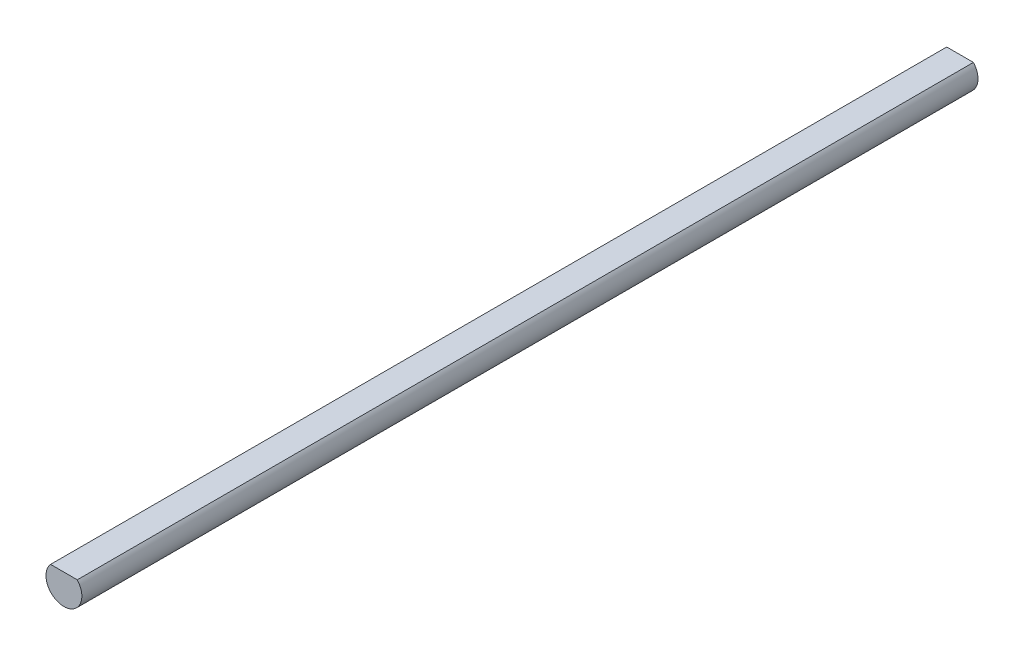
ISO-10303-21;
HEADER;
FILE_DESCRIPTION(('STEP AP214'),'2;1');
FILE_NAME('part.step','',(''),(''),'','','');
FILE_SCHEMA(('AUTOMOTIVE_DESIGN { 1 0 10303 214 1 1 1 1 }'));
ENDSEC;
DATA;
#1=APPLICATION_CONTEXT('core data for automotive mechanical design processes');
#2=APPLICATION_PROTOCOL_DEFINITION('international standard','automotive_design',2000,#1);
#3=PRODUCT_CONTEXT('',#1,'mechanical');
#4=PRODUCT('Part','Part','',(#3));
#5=PRODUCT_RELATED_PRODUCT_CATEGORY('part','',(#4));
#6=PRODUCT_DEFINITION_FORMATION('','',#4);
#7=PRODUCT_DEFINITION_CONTEXT('part definition',#1,'design');
#8=PRODUCT_DEFINITION('design','',#6,#7);
#9=PRODUCT_DEFINITION_SHAPE('','',#8);
#10=(LENGTH_UNIT() NAMED_UNIT(*) SI_UNIT(.MILLI.,.METRE.));
#11=(NAMED_UNIT(*) PLANE_ANGLE_UNIT() SI_UNIT($,.RADIAN.));
#12=(NAMED_UNIT(*) SI_UNIT($,.STERADIAN.) SOLID_ANGLE_UNIT());
#13=UNCERTAINTY_MEASURE_WITH_UNIT(LENGTH_MEASURE(1.E-05),#10,'distance_accuracy_value','');
#14=(GEOMETRIC_REPRESENTATION_CONTEXT(3) GLOBAL_UNCERTAINTY_ASSIGNED_CONTEXT((#13)) GLOBAL_UNIT_ASSIGNED_CONTEXT((#10,
#11,#12)) REPRESENTATION_CONTEXT('',''));
#15=CARTESIAN_POINT('',(0.,0.,0.));
#16=DIRECTION('',(0.,0.,1.));
#17=DIRECTION('',(1.,0.,0.));
#18=AXIS2_PLACEMENT_3D('',#15,#16,#17);
#19=CARTESIAN_POINT('',(0.,0.,300.));
#20=DIRECTION('',(0.,0.,-1.));
#21=DIRECTION('',(-1.,0.,0.));
#22=AXIS2_PLACEMENT_3D('',#19,#20,#21);
#23=CYLINDRICAL_SURFACE('',#22,6.);
#24=CARTESIAN_POINT('',(0.,0.,300.));
#25=DIRECTION('',(0.,0.,1.));
#26=DIRECTION('',(1.,0.,0.));
#27=AXIS2_PLACEMENT_3D('',#24,#25,#26);
#28=CIRCLE('',#27,6.);
#29=CARTESIAN_POINT('',(-4.47213595499958,4.,300.));
#30=VERTEX_POINT('',#29);
#31=CARTESIAN_POINT('',(4.47213595499958,4.,300.));
#32=VERTEX_POINT('',#31);
#33=EDGE_CURVE('E11',#30,#32,#28,.T.);
#34=ORIENTED_EDGE('',*,*,#33,.F.);
#35=DIRECTION('',(0.,0.,1.));
#36=VECTOR('',#35,1.);
#37=CARTESIAN_POINT('',(-4.47213595499958,4.,0.));
#38=LINE('',#37,#36);
#39=CARTESIAN_POINT('',(-4.47213595499958,4.,0.));
#40=VERTEX_POINT('',#39);
#41=EDGE_CURVE('E58',#40,#30,#38,.T.);
#42=ORIENTED_EDGE('',*,*,#41,.F.);
#43=CARTESIAN_POINT('',(0.,0.,0.));
#44=DIRECTION('',(0.,0.,1.));
#45=DIRECTION('',(1.,0.,0.));
#46=AXIS2_PLACEMENT_3D('',#43,#44,#45);
#47=CIRCLE('',#46,6.);
#48=CARTESIAN_POINT('',(4.47213595499958,4.,0.));
#49=VERTEX_POINT('',#48);
#50=EDGE_CURVE('E38',#40,#49,#47,.T.);
#51=ORIENTED_EDGE('',*,*,#50,.T.);
#52=DIRECTION('',(0.,0.,1.));
#53=VECTOR('',#52,1.);
#54=CARTESIAN_POINT('',(4.47213595499958,4.,0.));
#55=LINE('',#54,#53);
#56=EDGE_CURVE('E49',#49,#32,#55,.T.);
#57=ORIENTED_EDGE('',*,*,#56,.T.);
#58=EDGE_LOOP('',(#34,#42,#51,#57));
#59=FACE_BOUND('',#58,.T.);
#60=ADVANCED_FACE('F35',(#59),#23,.T.);
#61=CARTESIAN_POINT('',(0.,0.,300.));
#62=DIRECTION('',(0.,0.,1.));
#63=DIRECTION('',(1.,0.,0.));
#64=AXIS2_PLACEMENT_3D('',#61,#62,#63);
#65=PLANE('',#64);
#66=DIRECTION('',(1.,0.,0.));
#67=VECTOR('',#66,1.);
#68=CARTESIAN_POINT('',(-4.47213595499958,4.,300.));
#69=LINE('',#68,#67);
#70=EDGE_CURVE('E61',#30,#32,#69,.T.);
#71=ORIENTED_EDGE('',*,*,#70,.F.);
#72=ORIENTED_EDGE('',*,*,#33,.T.);
#73=EDGE_LOOP('',(#71,#72));
#74=FACE_BOUND('',#73,.T.);
#75=ADVANCED_FACE('F68',(#74),#65,.T.);
#76=CARTESIAN_POINT('',(0.,0.,0.));
#77=DIRECTION('',(0.,0.,1.));
#78=DIRECTION('',(1.,0.,0.));
#79=AXIS2_PLACEMENT_3D('',#76,#77,#78);
#80=PLANE('',#79);
#81=ORIENTED_EDGE('',*,*,#50,.F.);
#82=DIRECTION('',(1.,0.,0.));
#83=VECTOR('',#82,1.);
#84=CARTESIAN_POINT('',(-4.47213595499958,4.,0.));
#85=LINE('',#84,#83);
#86=EDGE_CURVE('E54',#40,#49,#85,.T.);
#87=ORIENTED_EDGE('',*,*,#86,.T.);
#88=EDGE_LOOP('',(#81,#87));
#89=FACE_BOUND('',#88,.T.);
#90=ADVANCED_FACE('F73',(#89),#80,.F.);
#91=CARTESIAN_POINT('',(-4.47213595499958,4.,0.));
#92=DIRECTION('',(0.,-1.,0.));
#93=DIRECTION('',(0.,0.,-1.));
#94=AXIS2_PLACEMENT_3D('',#91,#92,#93);
#95=PLANE('',#94);
#96=ORIENTED_EDGE('',*,*,#70,.T.);
#97=ORIENTED_EDGE('',*,*,#56,.F.);
#98=ORIENTED_EDGE('',*,*,#86,.F.);
#99=ORIENTED_EDGE('',*,*,#41,.T.);
#100=EDGE_LOOP('',(#96,#97,#98,#99));
#101=FACE_BOUND('',#100,.T.);
#102=ADVANCED_FACE('F60',(#101),#95,.F.);
#103=CLOSED_SHELL('',(#60,#75,#90,#102));
#104=MANIFOLD_SOLID_BREP('B2',#103);
#105=ADVANCED_BREP_SHAPE_REPRESENTATION('',(#18,#104),#14);
#106=SHAPE_DEFINITION_REPRESENTATION(#9,#105);
ENDSEC;
END-ISO-10303-21;
